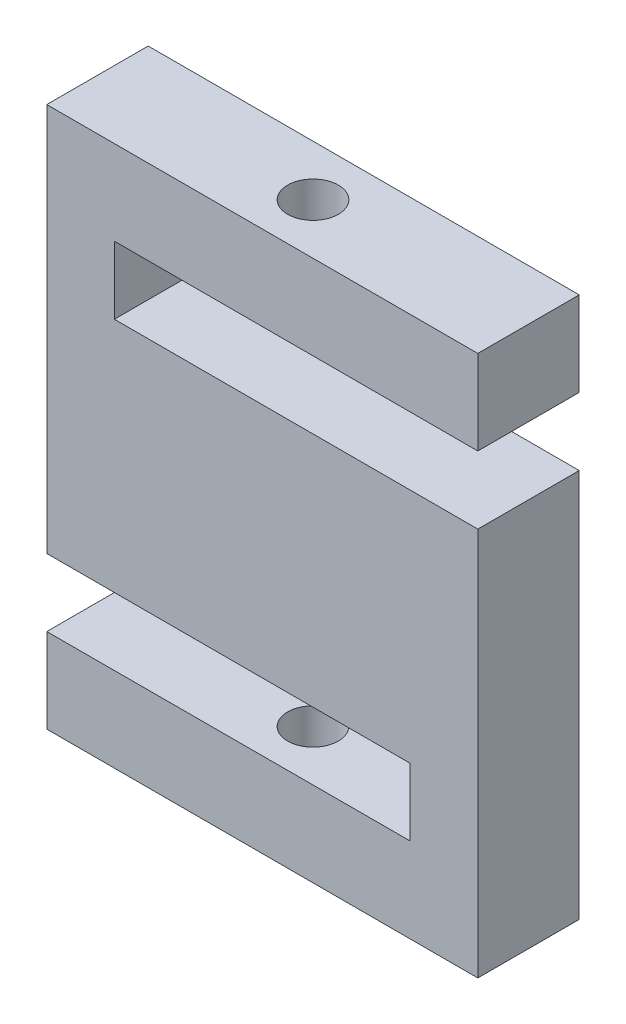
ISO-10303-21;
HEADER;
FILE_DESCRIPTION(('STEP AP214'),'2;1');
FILE_NAME('part.step','',(''),(''),'','','');
FILE_SCHEMA(('AUTOMOTIVE_DESIGN { 1 0 10303 214 1 1 1 1 }'));
ENDSEC;
DATA;
#1=APPLICATION_CONTEXT('core data for automotive mechanical design processes');
#2=APPLICATION_PROTOCOL_DEFINITION('international standard','automotive_design',2000,#1);
#3=PRODUCT_CONTEXT('',#1,'mechanical');
#4=PRODUCT('Part','Part','',(#3));
#5=PRODUCT_RELATED_PRODUCT_CATEGORY('part','',(#4));
#6=PRODUCT_DEFINITION_FORMATION('','',#4);
#7=PRODUCT_DEFINITION_CONTEXT('part definition',#1,'design');
#8=PRODUCT_DEFINITION('design','',#6,#7);
#9=PRODUCT_DEFINITION_SHAPE('','',#8);
#10=(LENGTH_UNIT() NAMED_UNIT(*) SI_UNIT(.MILLI.,.METRE.));
#11=(NAMED_UNIT(*) PLANE_ANGLE_UNIT() SI_UNIT($,.RADIAN.));
#12=(NAMED_UNIT(*) SI_UNIT($,.STERADIAN.) SOLID_ANGLE_UNIT());
#13=UNCERTAINTY_MEASURE_WITH_UNIT(LENGTH_MEASURE(1.E-05),#10,'distance_accuracy_value','');
#14=(GEOMETRIC_REPRESENTATION_CONTEXT(3) GLOBAL_UNCERTAINTY_ASSIGNED_CONTEXT((#13)) GLOBAL_UNIT_ASSIGNED_CONTEXT((#10,
#11,#12)) REPRESENTATION_CONTEXT('',''));
#15=CARTESIAN_POINT('',(0.,0.,0.));
#16=DIRECTION('',(0.,0.,1.));
#17=DIRECTION('',(1.,0.,0.));
#18=AXIS2_PLACEMENT_3D('',#15,#16,#17);
#19=CARTESIAN_POINT('',(-25.5,32.,12.));
#20=DIRECTION('',(1.,0.,0.));
#21=DIRECTION('',(0.,0.,-1.));
#22=AXIS2_PLACEMENT_3D('',#19,#20,#21);
#23=PLANE('',#22);
#24=DIRECTION('',(0.,-1.,0.));
#25=VECTOR('',#24,1.);
#26=CARTESIAN_POINT('',(-25.5,32.,0.));
#27=LINE('',#26,#25);
#28=CARTESIAN_POINT('',(-25.5,32.,0.));
#29=VERTEX_POINT('',#28);
#30=CARTESIAN_POINT('',(-25.5,-14.,0.));
#31=VERTEX_POINT('',#30);
#32=EDGE_CURVE('E170',#29,#31,#27,.T.);
#33=ORIENTED_EDGE('',*,*,#32,.T.);
#34=DIRECTION('',(0.,0.,-1.));
#35=VECTOR('',#34,1.);
#36=CARTESIAN_POINT('',(-25.5,-14.,12.));
#37=LINE('',#36,#35);
#38=CARTESIAN_POINT('',(-25.5,-14.,12.));
#39=VERTEX_POINT('',#38);
#40=EDGE_CURVE('E11',#39,#31,#37,.T.);
#41=ORIENTED_EDGE('',*,*,#40,.F.);
#42=DIRECTION('',(0.,-1.,0.));
#43=VECTOR('',#42,1.);
#44=CARTESIAN_POINT('',(-25.5,32.,12.));
#45=LINE('',#44,#43);
#46=CARTESIAN_POINT('',(-25.5,32.,12.));
#47=VERTEX_POINT('',#46);
#48=EDGE_CURVE('E205',#47,#39,#45,.T.);
#49=ORIENTED_EDGE('',*,*,#48,.F.);
#50=DIRECTION('',(0.,0.,-1.));
#51=VECTOR('',#50,1.);
#52=CARTESIAN_POINT('',(-25.5,32.,12.));
#53=LINE('',#52,#51);
#54=EDGE_CURVE('E166',#47,#29,#53,.T.);
#55=ORIENTED_EDGE('',*,*,#54,.T.);
#56=EDGE_LOOP('',(#33,#41,#49,#55));
#57=FACE_BOUND('',#56,.T.);
#58=ADVANCED_FACE('F45',(#57),#23,.F.);
#59=CARTESIAN_POINT('',(-25.5,-14.,12.));
#60=DIRECTION('',(0.,1.,0.));
#61=DIRECTION('',(-1.,0.,0.));
#62=AXIS2_PLACEMENT_3D('',#59,#60,#61);
#63=PLANE('',#62);
#64=DIRECTION('',(1.,0.,0.));
#65=VECTOR('',#64,1.);
#66=CARTESIAN_POINT('',(-25.5,-14.,0.));
#67=LINE('',#66,#65);
#68=CARTESIAN_POINT('',(17.5,-14.,0.));
#69=VERTEX_POINT('',#68);
#70=EDGE_CURVE('E174',#31,#69,#67,.T.);
#71=ORIENTED_EDGE('',*,*,#70,.T.);
#72=DIRECTION('',(0.,0.,-1.));
#73=VECTOR('',#72,1.);
#74=CARTESIAN_POINT('',(17.5,-14.,12.));
#75=LINE('',#74,#73);
#76=CARTESIAN_POINT('',(17.5,-14.,12.));
#77=VERTEX_POINT('',#76);
#78=EDGE_CURVE('E54',#77,#69,#75,.T.);
#79=ORIENTED_EDGE('',*,*,#78,.F.);
#80=DIRECTION('',(1.,0.,0.));
#81=VECTOR('',#80,1.);
#82=CARTESIAN_POINT('',(-25.5,-14.,12.));
#83=LINE('',#82,#81);
#84=EDGE_CURVE('E117',#39,#77,#83,.T.);
#85=ORIENTED_EDGE('',*,*,#84,.F.);
#86=ORIENTED_EDGE('',*,*,#40,.T.);
#87=EDGE_LOOP('',(#71,#79,#85,#86));
#88=FACE_BOUND('',#87,.T.);
#89=ADVANCED_FACE('F303',(#88),#63,.F.);
#90=CARTESIAN_POINT('',(17.5,-14.,12.));
#91=DIRECTION('',(1.,0.,0.));
#92=DIRECTION('',(0.,1.,0.));
#93=AXIS2_PLACEMENT_3D('',#90,#91,#92);
#94=PLANE('',#93);
#95=DIRECTION('',(0.,-1.,0.));
#96=VECTOR('',#95,1.);
#97=CARTESIAN_POINT('',(17.5,-14.,0.));
#98=LINE('',#97,#96);
#99=CARTESIAN_POINT('',(17.5,-21.9607843137255,0.));
#100=VERTEX_POINT('',#99);
#101=EDGE_CURVE('E178',#69,#100,#98,.T.);
#102=ORIENTED_EDGE('',*,*,#101,.T.);
#103=DIRECTION('',(0.,0.,-1.));
#104=VECTOR('',#103,1.);
#105=CARTESIAN_POINT('',(17.5,-21.9607843137255,12.));
#106=LINE('',#105,#104);
#107=CARTESIAN_POINT('',(17.5,-21.9607843137255,12.));
#108=VERTEX_POINT('',#107);
#109=EDGE_CURVE('E232',#108,#100,#106,.T.);
#110=ORIENTED_EDGE('',*,*,#109,.F.);
#111=DIRECTION('',(0.,-1.,0.));
#112=VECTOR('',#111,1.);
#113=CARTESIAN_POINT('',(17.5,-14.,12.));
#114=LINE('',#113,#112);
#115=EDGE_CURVE('E242',#77,#108,#114,.T.);
#116=ORIENTED_EDGE('',*,*,#115,.F.);
#117=ORIENTED_EDGE('',*,*,#78,.T.);
#118=EDGE_LOOP('',(#102,#110,#116,#117));
#119=FACE_BOUND('',#118,.T.);
#120=ADVANCED_FACE('F240',(#119),#94,.F.);
#121=CARTESIAN_POINT('',(17.5,-21.9607843137255,12.));
#122=DIRECTION('',(0.000911992324792485,-0.999999584134913,0.));
#123=DIRECTION('',(0.999999584134913,0.000911992324792485,0.));
#124=AXIS2_PLACEMENT_3D('',#121,#122,#123);
#125=PLANE('',#124);
#126=CARTESIAN_POINT('',(0.,-21.9767441860465,6.));
#127=DIRECTION('',(0.000911992324792485,-0.999999584134913,0.));
#128=DIRECTION('',(-0.999999584134913,-0.000911992324792485,0.));
#129=AXIS2_PLACEMENT_3D('',#126,#127,#128);
#130=ELLIPSE('',#129,3.00000124759578,3.);
#131=CARTESIAN_POINT('',(-3.,-21.9794801641587,6.));
#132=VERTEX_POINT('',#131);
#133=EDGE_CURVE('E340',#132,#132,#130,.F.);
#134=ORIENTED_EDGE('',*,*,#133,.F.);
#135=EDGE_LOOP('',(#134));
#136=FACE_BOUND('',#135,.T.);
#137=DIRECTION('',(-0.999999584134913,-0.000911992324792484,0.));
#138=VECTOR('',#137,1.);
#139=CARTESIAN_POINT('',(17.5,-21.9607843137255,0.));
#140=LINE('',#139,#138);
#141=CARTESIAN_POINT('',(-25.5,-22.,0.));
#142=VERTEX_POINT('',#141);
#143=EDGE_CURVE('E181',#100,#142,#140,.T.);
#144=ORIENTED_EDGE('',*,*,#143,.T.);
#145=DIRECTION('',(0.,0.,-1.));
#146=VECTOR('',#145,1.);
#147=CARTESIAN_POINT('',(-25.5,-22.,12.));
#148=LINE('',#147,#146);
#149=CARTESIAN_POINT('',(-25.5,-22.,12.));
#150=VERTEX_POINT('',#149);
#151=EDGE_CURVE('E228',#150,#142,#148,.T.);
#152=ORIENTED_EDGE('',*,*,#151,.F.);
#153=DIRECTION('',(-0.999999584134913,-0.000911992324792484,0.));
#154=VECTOR('',#153,1.);
#155=CARTESIAN_POINT('',(17.5,-21.9607843137255,12.));
#156=LINE('',#155,#154);
#157=EDGE_CURVE('E261',#108,#150,#156,.T.);
#158=ORIENTED_EDGE('',*,*,#157,.F.);
#159=ORIENTED_EDGE('',*,*,#109,.T.);
#160=EDGE_LOOP('',(#144,#152,#158,#159));
#161=FACE_BOUND('',#160,.T.);
#162=ADVANCED_FACE('F251',(#136,#161),#125,.F.);
#163=CARTESIAN_POINT('',(-25.5,-22.,12.));
#164=DIRECTION('',(1.,0.,0.));
#165=DIRECTION('',(0.,0.,-1.));
#166=AXIS2_PLACEMENT_3D('',#163,#164,#165);
#167=PLANE('',#166);
#168=DIRECTION('',(0.,-1.,0.));
#169=VECTOR('',#168,1.);
#170=CARTESIAN_POINT('',(-25.5,-22.,0.));
#171=LINE('',#170,#169);
#172=CARTESIAN_POINT('',(-25.5,-32.,0.));
#173=VERTEX_POINT('',#172);
#174=EDGE_CURVE('E184',#142,#173,#171,.T.);
#175=ORIENTED_EDGE('',*,*,#174,.T.);
#176=DIRECTION('',(0.,0.,-1.));
#177=VECTOR('',#176,1.);
#178=CARTESIAN_POINT('',(-25.5,-32.,12.));
#179=LINE('',#178,#177);
#180=CARTESIAN_POINT('',(-25.5,-32.,12.));
#181=VERTEX_POINT('',#180);
#182=EDGE_CURVE('E224',#181,#173,#179,.T.);
#183=ORIENTED_EDGE('',*,*,#182,.F.);
#184=DIRECTION('',(0.,-1.,0.));
#185=VECTOR('',#184,1.);
#186=CARTESIAN_POINT('',(-25.5,-22.,12.));
#187=LINE('',#186,#185);
#188=EDGE_CURVE('E257',#150,#181,#187,.T.);
#189=ORIENTED_EDGE('',*,*,#188,.F.);
#190=ORIENTED_EDGE('',*,*,#151,.T.);
#191=EDGE_LOOP('',(#175,#183,#189,#190));
#192=FACE_BOUND('',#191,.T.);
#193=ADVANCED_FACE('F255',(#192),#167,.F.);
#194=CARTESIAN_POINT('',(-25.5,-32.,12.));
#195=DIRECTION('',(0.,1.,0.));
#196=DIRECTION('',(0.,0.,1.));
#197=AXIS2_PLACEMENT_3D('',#194,#195,#196);
#198=PLANE('',#197);
#199=CARTESIAN_POINT('',(0.,-32.,6.));
#200=DIRECTION('',(0.,1.,0.));
#201=DIRECTION('',(0.,0.,1.));
#202=AXIS2_PLACEMENT_3D('',#199,#200,#201);
#203=CIRCLE('',#202,3.);
#204=CARTESIAN_POINT('',(0.,-32.,9.));
#205=VERTEX_POINT('',#204);
#206=EDGE_CURVE('E351',#205,#205,#203,.T.);
#207=ORIENTED_EDGE('',*,*,#206,.T.);
#208=EDGE_LOOP('',(#207));
#209=FACE_BOUND('',#208,.T.);
#210=DIRECTION('',(1.,0.,0.));
#211=VECTOR('',#210,1.);
#212=CARTESIAN_POINT('',(-25.5,-32.,0.));
#213=LINE('',#212,#211);
#214=CARTESIAN_POINT('',(25.5,-32.,0.));
#215=VERTEX_POINT('',#214);
#216=EDGE_CURVE('E187',#173,#215,#213,.T.);
#217=ORIENTED_EDGE('',*,*,#216,.T.);
#218=DIRECTION('',(0.,0.,-1.));
#219=VECTOR('',#218,1.);
#220=CARTESIAN_POINT('',(25.5,-32.,12.));
#221=LINE('',#220,#219);
#222=CARTESIAN_POINT('',(25.5,-32.,12.));
#223=VERTEX_POINT('',#222);
#224=EDGE_CURVE('E220',#223,#215,#221,.T.);
#225=ORIENTED_EDGE('',*,*,#224,.F.);
#226=DIRECTION('',(1.,0.,0.));
#227=VECTOR('',#226,1.);
#228=CARTESIAN_POINT('',(-25.5,-32.,12.));
#229=LINE('',#228,#227);
#230=EDGE_CURVE('E260',#181,#223,#229,.T.);
#231=ORIENTED_EDGE('',*,*,#230,.F.);
#232=ORIENTED_EDGE('',*,*,#182,.T.);
#233=EDGE_LOOP('',(#217,#225,#231,#232));
#234=FACE_BOUND('',#233,.T.);
#235=ADVANCED_FACE('F317',(#209,#234),#198,.F.);
#236=CARTESIAN_POINT('',(25.5,-32.,12.));
#237=DIRECTION('',(-1.,0.,0.));
#238=DIRECTION('',(0.,0.,1.));
#239=AXIS2_PLACEMENT_3D('',#236,#237,#238);
#240=PLANE('',#239);
#241=DIRECTION('',(0.,1.,0.));
#242=VECTOR('',#241,1.);
#243=CARTESIAN_POINT('',(25.5,-32.,0.));
#244=LINE('',#243,#242);
#245=CARTESIAN_POINT('',(25.5,14.,0.));
#246=VERTEX_POINT('',#245);
#247=EDGE_CURVE('E190',#215,#246,#244,.T.);
#248=ORIENTED_EDGE('',*,*,#247,.T.);
#249=DIRECTION('',(0.,0.,-1.));
#250=VECTOR('',#249,1.);
#251=CARTESIAN_POINT('',(25.5,14.,12.));
#252=LINE('',#251,#250);
#253=CARTESIAN_POINT('',(25.5,14.,12.));
#254=VERTEX_POINT('',#253);
#255=EDGE_CURVE('E216',#254,#246,#252,.T.);
#256=ORIENTED_EDGE('',*,*,#255,.F.);
#257=DIRECTION('',(0.,1.,0.));
#258=VECTOR('',#257,1.);
#259=CARTESIAN_POINT('',(25.5,-32.,12.));
#260=LINE('',#259,#258);
#261=EDGE_CURVE('E265',#223,#254,#260,.T.);
#262=ORIENTED_EDGE('',*,*,#261,.F.);
#263=ORIENTED_EDGE('',*,*,#224,.T.);
#264=EDGE_LOOP('',(#248,#256,#262,#263));
#265=FACE_BOUND('',#264,.T.);
#266=ADVANCED_FACE('F320',(#265),#240,.F.);
#267=CARTESIAN_POINT('',(25.5,14.,12.));
#268=DIRECTION('',(0.,-1.,0.));
#269=DIRECTION('',(1.,0.,0.));
#270=AXIS2_PLACEMENT_3D('',#267,#268,#269);
#271=PLANE('',#270);
#272=DIRECTION('',(-1.,0.,0.));
#273=VECTOR('',#272,1.);
#274=CARTESIAN_POINT('',(25.5,14.,0.));
#275=LINE('',#274,#273);
#276=CARTESIAN_POINT('',(-17.5,14.,0.));
#277=VERTEX_POINT('',#276);
#278=EDGE_CURVE('E193',#246,#277,#275,.T.);
#279=ORIENTED_EDGE('',*,*,#278,.T.);
#280=DIRECTION('',(0.,0.,-1.));
#281=VECTOR('',#280,1.);
#282=CARTESIAN_POINT('',(-17.5,14.,12.));
#283=LINE('',#282,#281);
#284=CARTESIAN_POINT('',(-17.5,14.,12.));
#285=VERTEX_POINT('',#284);
#286=EDGE_CURVE('E212',#285,#277,#283,.T.);
#287=ORIENTED_EDGE('',*,*,#286,.F.);
#288=DIRECTION('',(-1.,0.,0.));
#289=VECTOR('',#288,1.);
#290=CARTESIAN_POINT('',(25.5,14.,12.));
#291=LINE('',#290,#289);
#292=EDGE_CURVE('E272',#254,#285,#291,.T.);
#293=ORIENTED_EDGE('',*,*,#292,.F.);
#294=ORIENTED_EDGE('',*,*,#255,.T.);
#295=EDGE_LOOP('',(#279,#287,#293,#294));
#296=FACE_BOUND('',#295,.T.);
#297=ADVANCED_FACE('F280',(#296),#271,.F.);
#298=CARTESIAN_POINT('',(-17.5,14.,12.));
#299=DIRECTION('',(-1.,0.,0.));
#300=DIRECTION('',(0.,-1.,0.));
#301=AXIS2_PLACEMENT_3D('',#298,#299,#300);
#302=PLANE('',#301);
#303=DIRECTION('',(0.,1.,0.));
#304=VECTOR('',#303,1.);
#305=CARTESIAN_POINT('',(-17.5,14.,0.));
#306=LINE('',#305,#304);
#307=CARTESIAN_POINT('',(-17.5,22.,0.));
#308=VERTEX_POINT('',#307);
#309=EDGE_CURVE('E196',#277,#308,#306,.T.);
#310=ORIENTED_EDGE('',*,*,#309,.T.);
#311=DIRECTION('',(0.,0.,-1.));
#312=VECTOR('',#311,1.);
#313=CARTESIAN_POINT('',(-17.5,22.,12.));
#314=LINE('',#313,#312);
#315=CARTESIAN_POINT('',(-17.5,22.,12.));
#316=VERTEX_POINT('',#315);
#317=EDGE_CURVE('E159',#316,#308,#314,.T.);
#318=ORIENTED_EDGE('',*,*,#317,.F.);
#319=DIRECTION('',(0.,1.,0.));
#320=VECTOR('',#319,1.);
#321=CARTESIAN_POINT('',(-17.5,14.,12.));
#322=LINE('',#321,#320);
#323=EDGE_CURVE('E148',#285,#316,#322,.T.);
#324=ORIENTED_EDGE('',*,*,#323,.F.);
#325=ORIENTED_EDGE('',*,*,#286,.T.);
#326=EDGE_LOOP('',(#310,#318,#324,#325));
#327=FACE_BOUND('',#326,.T.);
#328=ADVANCED_FACE('F284',(#327),#302,.F.);
#329=CARTESIAN_POINT('',(-17.5,22.,12.));
#330=DIRECTION('',(0.,1.,0.));
#331=DIRECTION('',(0.,0.,1.));
#332=AXIS2_PLACEMENT_3D('',#329,#330,#331);
#333=PLANE('',#332);
#334=CARTESIAN_POINT('',(0.,22.,6.));
#335=DIRECTION('',(0.,1.,0.));
#336=DIRECTION('',(0.,0.,1.));
#337=AXIS2_PLACEMENT_3D('',#334,#335,#336);
#338=CIRCLE('',#337,3.);
#339=CARTESIAN_POINT('',(0.,22.,9.));
#340=VERTEX_POINT('',#339);
#341=EDGE_CURVE('E175',#340,#340,#338,.F.);
#342=ORIENTED_EDGE('',*,*,#341,.F.);
#343=EDGE_LOOP('',(#342));
#344=FACE_BOUND('',#343,.T.);
#345=DIRECTION('',(1.,0.,0.));
#346=VECTOR('',#345,1.);
#347=CARTESIAN_POINT('',(-17.5,22.,0.));
#348=LINE('',#347,#346);
#349=CARTESIAN_POINT('',(25.5,22.,0.));
#350=VERTEX_POINT('',#349);
#351=EDGE_CURVE('E157',#308,#350,#348,.T.);
#352=ORIENTED_EDGE('',*,*,#351,.T.);
#353=DIRECTION('',(0.,0.,-1.));
#354=VECTOR('',#353,1.);
#355=CARTESIAN_POINT('',(25.5,22.,12.));
#356=LINE('',#355,#354);
#357=CARTESIAN_POINT('',(25.5,22.,12.));
#358=VERTEX_POINT('',#357);
#359=EDGE_CURVE('E154',#358,#350,#356,.T.);
#360=ORIENTED_EDGE('',*,*,#359,.F.);
#361=DIRECTION('',(1.,0.,0.));
#362=VECTOR('',#361,1.);
#363=CARTESIAN_POINT('',(-17.5,22.,12.));
#364=LINE('',#363,#362);
#365=EDGE_CURVE('E142',#316,#358,#364,.T.);
#366=ORIENTED_EDGE('',*,*,#365,.F.);
#367=ORIENTED_EDGE('',*,*,#317,.T.);
#368=EDGE_LOOP('',(#352,#360,#366,#367));
#369=FACE_BOUND('',#368,.T.);
#370=ADVANCED_FACE('F155',(#344,#369),#333,.F.);
#371=CARTESIAN_POINT('',(25.5,22.,12.));
#372=DIRECTION('',(-1.,0.,0.));
#373=DIRECTION('',(0.,0.,1.));
#374=AXIS2_PLACEMENT_3D('',#371,#372,#373);
#375=PLANE('',#374);
#376=DIRECTION('',(0.,1.,0.));
#377=VECTOR('',#376,1.);
#378=CARTESIAN_POINT('',(25.5,22.,0.));
#379=LINE('',#378,#377);
#380=CARTESIAN_POINT('',(25.5,32.,0.));
#381=VERTEX_POINT('',#380);
#382=EDGE_CURVE('E103',#350,#381,#379,.T.);
#383=ORIENTED_EDGE('',*,*,#382,.T.);
#384=DIRECTION('',(0.,0.,-1.));
#385=VECTOR('',#384,1.);
#386=CARTESIAN_POINT('',(25.5,32.,12.));
#387=LINE('',#386,#385);
#388=CARTESIAN_POINT('',(25.5,32.,12.));
#389=VERTEX_POINT('',#388);
#390=EDGE_CURVE('E160',#389,#381,#387,.T.);
#391=ORIENTED_EDGE('',*,*,#390,.F.);
#392=DIRECTION('',(0.,1.,0.));
#393=VECTOR('',#392,1.);
#394=CARTESIAN_POINT('',(25.5,22.,12.));
#395=LINE('',#394,#393);
#396=EDGE_CURVE('E146',#358,#389,#395,.T.);
#397=ORIENTED_EDGE('',*,*,#396,.F.);
#398=ORIENTED_EDGE('',*,*,#359,.T.);
#399=EDGE_LOOP('',(#383,#391,#397,#398));
#400=FACE_BOUND('',#399,.T.);
#401=ADVANCED_FACE('F162',(#400),#375,.F.);
#402=CARTESIAN_POINT('',(25.5,32.,12.));
#403=DIRECTION('',(0.,-1.,0.));
#404=DIRECTION('',(0.,0.,-1.));
#405=AXIS2_PLACEMENT_3D('',#402,#403,#404);
#406=PLANE('',#405);
#407=CARTESIAN_POINT('',(0.,32.,6.));
#408=DIRECTION('',(0.,-1.,0.));
#409=DIRECTION('',(0.,0.,-1.));
#410=AXIS2_PLACEMENT_3D('',#407,#408,#409);
#411=CIRCLE('',#410,3.);
#412=CARTESIAN_POINT('',(0.,32.,3.));
#413=VERTEX_POINT('',#412);
#414=EDGE_CURVE('E337',#413,#413,#411,.T.);
#415=ORIENTED_EDGE('',*,*,#414,.T.);
#416=EDGE_LOOP('',(#415));
#417=FACE_BOUND('',#416,.T.);
#418=DIRECTION('',(-1.,0.,0.));
#419=VECTOR('',#418,1.);
#420=CARTESIAN_POINT('',(25.5,32.,0.));
#421=LINE('',#420,#419);
#422=EDGE_CURVE('E109',#381,#29,#421,.T.);
#423=ORIENTED_EDGE('',*,*,#422,.T.);
#424=ORIENTED_EDGE('',*,*,#54,.F.);
#425=DIRECTION('',(-1.,0.,0.));
#426=VECTOR('',#425,1.);
#427=CARTESIAN_POINT('',(25.5,32.,12.));
#428=LINE('',#427,#426);
#429=EDGE_CURVE('E62',#389,#47,#428,.T.);
#430=ORIENTED_EDGE('',*,*,#429,.F.);
#431=ORIENTED_EDGE('',*,*,#390,.T.);
#432=EDGE_LOOP('',(#423,#424,#430,#431));
#433=FACE_BOUND('',#432,.T.);
#434=ADVANCED_FACE('F288',(#417,#433),#406,.F.);
#435=CARTESIAN_POINT('',(0.,0.,12.));
#436=DIRECTION('',(0.,0.,1.));
#437=DIRECTION('',(1.,0.,0.));
#438=AXIS2_PLACEMENT_3D('',#435,#436,#437);
#439=PLANE('',#438);
#440=ORIENTED_EDGE('',*,*,#48,.T.);
#441=ORIENTED_EDGE('',*,*,#84,.T.);
#442=ORIENTED_EDGE('',*,*,#115,.T.);
#443=ORIENTED_EDGE('',*,*,#157,.T.);
#444=ORIENTED_EDGE('',*,*,#188,.T.);
#445=ORIENTED_EDGE('',*,*,#230,.T.);
#446=ORIENTED_EDGE('',*,*,#261,.T.);
#447=ORIENTED_EDGE('',*,*,#292,.T.);
#448=ORIENTED_EDGE('',*,*,#323,.T.);
#449=ORIENTED_EDGE('',*,*,#365,.T.);
#450=ORIENTED_EDGE('',*,*,#396,.T.);
#451=ORIENTED_EDGE('',*,*,#429,.T.);
#452=EDGE_LOOP('',(#440,#441,#442,#443,#444,#445,#446,#447,#448,#449,#450,#451));
#453=FACE_BOUND('',#452,.T.);
#454=ADVANCED_FACE('F144',(#453),#439,.T.);
#455=CARTESIAN_POINT('',(0.,0.,0.));
#456=DIRECTION('',(0.,0.,1.));
#457=DIRECTION('',(1.,0.,0.));
#458=AXIS2_PLACEMENT_3D('',#455,#456,#457);
#459=PLANE('',#458);
#460=ORIENTED_EDGE('',*,*,#32,.F.);
#461=ORIENTED_EDGE('',*,*,#422,.F.);
#462=ORIENTED_EDGE('',*,*,#382,.F.);
#463=ORIENTED_EDGE('',*,*,#351,.F.);
#464=ORIENTED_EDGE('',*,*,#309,.F.);
#465=ORIENTED_EDGE('',*,*,#278,.F.);
#466=ORIENTED_EDGE('',*,*,#247,.F.);
#467=ORIENTED_EDGE('',*,*,#216,.F.);
#468=ORIENTED_EDGE('',*,*,#174,.F.);
#469=ORIENTED_EDGE('',*,*,#143,.F.);
#470=ORIENTED_EDGE('',*,*,#101,.F.);
#471=ORIENTED_EDGE('',*,*,#70,.F.);
#472=EDGE_LOOP('',(#460,#461,#462,#463,#464,#465,#466,#467,#468,#469,#470,#471));
#473=FACE_BOUND('',#472,.T.);
#474=ADVANCED_FACE('F246',(#473),#459,.F.);
#475=CARTESIAN_POINT('',(0.,20.,6.));
#476=DIRECTION('',(0.,1.,0.));
#477=DIRECTION('',(0.,0.,1.));
#478=AXIS2_PLACEMENT_3D('',#475,#476,#477);
#479=CYLINDRICAL_SURFACE('',#478,3.);
#480=ORIENTED_EDGE('',*,*,#414,.F.);
#481=EDGE_LOOP('',(#480));
#482=FACE_BOUND('',#481,.T.);
#483=ORIENTED_EDGE('',*,*,#341,.T.);
#484=EDGE_LOOP('',(#483));
#485=FACE_BOUND('',#484,.T.);
#486=ADVANCED_FACE('F360',(#482,#485),#479,.F.);
#487=CARTESIAN_POINT('',(0.,-20.,6.));
#488=DIRECTION('',(0.,-1.,0.));
#489=DIRECTION('',(0.,0.,-1.));
#490=AXIS2_PLACEMENT_3D('',#487,#488,#489);
#491=CYLINDRICAL_SURFACE('',#490,3.);
#492=ORIENTED_EDGE('',*,*,#206,.F.);
#493=EDGE_LOOP('',(#492));
#494=FACE_BOUND('',#493,.T.);
#495=ORIENTED_EDGE('',*,*,#133,.T.);
#496=EDGE_LOOP('',(#495));
#497=FACE_BOUND('',#496,.T.);
#498=ADVANCED_FACE('F357',(#494,#497),#491,.F.);
#499=CLOSED_SHELL('',(#58,#89,#120,#162,#193,#235,#266,#297,#328,#370,#401,#434,#454,#474,#486,#498));
#500=MANIFOLD_SOLID_BREP('B2',#499);
#501=ADVANCED_BREP_SHAPE_REPRESENTATION('',(#18,#500),#14);
#502=SHAPE_DEFINITION_REPRESENTATION(#9,#501);
ENDSEC;
END-ISO-10303-21;
